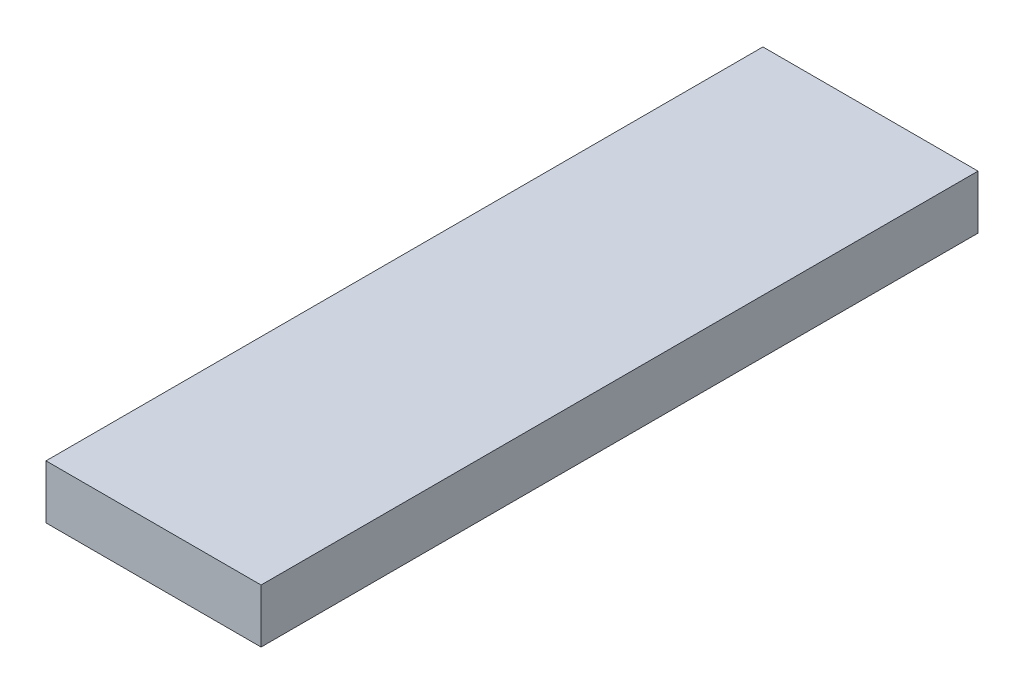
ISO-10303-21;
HEADER;
FILE_DESCRIPTION(('STEP AP214'),'2;1');
FILE_NAME('part.step','',(''),(''),'','','');
FILE_SCHEMA(('AUTOMOTIVE_DESIGN { 1 0 10303 214 1 1 1 1 }'));
ENDSEC;
DATA;
#1=APPLICATION_CONTEXT('core data for automotive mechanical design processes');
#2=APPLICATION_PROTOCOL_DEFINITION('international standard','automotive_design',2000,#1);
#3=PRODUCT_CONTEXT('',#1,'mechanical');
#4=PRODUCT('Part','Part','',(#3));
#5=PRODUCT_RELATED_PRODUCT_CATEGORY('part','',(#4));
#6=PRODUCT_DEFINITION_FORMATION('','',#4);
#7=PRODUCT_DEFINITION_CONTEXT('part definition',#1,'design');
#8=PRODUCT_DEFINITION('design','',#6,#7);
#9=PRODUCT_DEFINITION_SHAPE('','',#8);
#10=(LENGTH_UNIT() NAMED_UNIT(*) SI_UNIT(.MILLI.,.METRE.));
#11=(NAMED_UNIT(*) PLANE_ANGLE_UNIT() SI_UNIT($,.RADIAN.));
#12=(NAMED_UNIT(*) SI_UNIT($,.STERADIAN.) SOLID_ANGLE_UNIT());
#13=UNCERTAINTY_MEASURE_WITH_UNIT(LENGTH_MEASURE(1.E-05),#10,'distance_accuracy_value','');
#14=(GEOMETRIC_REPRESENTATION_CONTEXT(3) GLOBAL_UNCERTAINTY_ASSIGNED_CONTEXT((#13)) GLOBAL_UNIT_ASSIGNED_CONTEXT((#10,
#11,#12)) REPRESENTATION_CONTEXT('',''));
#15=CARTESIAN_POINT('',(0.,0.,0.));
#16=DIRECTION('',(0.,0.,1.));
#17=DIRECTION('',(1.,0.,0.));
#18=AXIS2_PLACEMENT_3D('',#15,#16,#17);
#19=CARTESIAN_POINT('',(0.,3.75,-50.));
#20=DIRECTION('',(1.,0.,0.));
#21=DIRECTION('',(0.,0.,-1.));
#22=AXIS2_PLACEMENT_3D('',#19,#20,#21);
#23=PLANE('',#22);
#24=DIRECTION('',(0.,0.,1.));
#25=VECTOR('',#24,1.);
#26=CARTESIAN_POINT('',(0.,-3.75,-50.));
#27=LINE('',#26,#25);
#28=CARTESIAN_POINT('',(0.,-3.75,-50.));
#29=VERTEX_POINT('',#28);
#30=CARTESIAN_POINT('',(0.,-3.75,50.));
#31=VERTEX_POINT('',#30);
#32=EDGE_CURVE('E149',#29,#31,#27,.T.);
#33=ORIENTED_EDGE('',*,*,#32,.T.);
#34=DIRECTION('',(0.,-1.,0.));
#35=VECTOR('',#34,1.);
#36=CARTESIAN_POINT('',(0.,3.75,50.));
#37=LINE('',#36,#35);
#38=CARTESIAN_POINT('',(0.,3.75,50.));
#39=VERTEX_POINT('',#38);
#40=EDGE_CURVE('E11',#39,#31,#37,.T.);
#41=ORIENTED_EDGE('',*,*,#40,.F.);
#42=DIRECTION('',(0.,0.,1.));
#43=VECTOR('',#42,1.);
#44=CARTESIAN_POINT('',(0.,3.75,-50.));
#45=LINE('',#44,#43);
#46=CARTESIAN_POINT('',(0.,3.75,-50.));
#47=VERTEX_POINT('',#46);
#48=EDGE_CURVE('E142',#47,#39,#45,.T.);
#49=ORIENTED_EDGE('',*,*,#48,.F.);
#50=DIRECTION('',(0.,-1.,0.));
#51=VECTOR('',#50,1.);
#52=CARTESIAN_POINT('',(0.,3.75,-50.));
#53=LINE('',#52,#51);
#54=EDGE_CURVE('E148',#47,#29,#53,.T.);
#55=ORIENTED_EDGE('',*,*,#54,.T.);
#56=EDGE_LOOP('',(#33,#41,#49,#55));
#57=FACE_BOUND('',#56,.T.);
#58=DIRECTION('',(0.,0.,1.));
#59=VECTOR('',#58,1.);
#60=CARTESIAN_POINT('',(0.,-3.25,-25.));
#61=LINE('',#60,#59);
#62=CARTESIAN_POINT('',(0.,-3.25,-25.));
#63=VERTEX_POINT('',#62);
#64=CARTESIAN_POINT('',(0.,-3.25,25.));
#65=VERTEX_POINT('',#64);
#66=EDGE_CURVE('E124',#63,#65,#61,.T.);
#67=ORIENTED_EDGE('',*,*,#66,.F.);
#68=DIRECTION('',(0.,1.,0.));
#69=VECTOR('',#68,1.);
#70=CARTESIAN_POINT('',(0.,-3.25,-25.));
#71=LINE('',#70,#69);
#72=CARTESIAN_POINT('',(0.,0.75,-25.));
#73=VERTEX_POINT('',#72);
#74=EDGE_CURVE('E153',#63,#73,#71,.T.);
#75=ORIENTED_EDGE('',*,*,#74,.T.);
#76=DIRECTION('',(0.,0.,1.));
#77=VECTOR('',#76,1.);
#78=CARTESIAN_POINT('',(0.,0.75,-25.));
#79=LINE('',#78,#77);
#80=CARTESIAN_POINT('',(0.,0.75,25.));
#81=VERTEX_POINT('',#80);
#82=EDGE_CURVE('E135',#73,#81,#79,.T.);
#83=ORIENTED_EDGE('',*,*,#82,.T.);
#84=DIRECTION('',(0.,1.,0.));
#85=VECTOR('',#84,1.);
#86=CARTESIAN_POINT('',(0.,-3.25,25.));
#87=LINE('',#86,#85);
#88=EDGE_CURVE('E117',#65,#81,#87,.T.);
#89=ORIENTED_EDGE('',*,*,#88,.F.);
#90=EDGE_LOOP('',(#67,#75,#83,#89));
#91=FACE_BOUND('',#90,.T.);
#92=ADVANCED_FACE('F40',(#57,#91),#23,.F.);
#93=CARTESIAN_POINT('',(0.,3.75,50.));
#94=DIRECTION('',(0.,0.,-1.));
#95=DIRECTION('',(-1.,0.,0.));
#96=AXIS2_PLACEMENT_3D('',#93,#94,#95);
#97=PLANE('',#96);
#98=DIRECTION('',(1.,0.,0.));
#99=VECTOR('',#98,1.);
#100=CARTESIAN_POINT('',(0.,-3.75,50.));
#101=LINE('',#100,#99);
#102=CARTESIAN_POINT('',(30.,-3.75,50.));
#103=VERTEX_POINT('',#102);
#104=EDGE_CURVE('E152',#31,#103,#101,.T.);
#105=ORIENTED_EDGE('',*,*,#104,.T.);
#106=DIRECTION('',(0.,-1.,0.));
#107=VECTOR('',#106,1.);
#108=CARTESIAN_POINT('',(30.,3.75,50.));
#109=LINE('',#108,#107);
#110=CARTESIAN_POINT('',(30.,3.75,50.));
#111=VERTEX_POINT('',#110);
#112=EDGE_CURVE('E47',#111,#103,#109,.T.);
#113=ORIENTED_EDGE('',*,*,#112,.F.);
#114=DIRECTION('',(1.,0.,0.));
#115=VECTOR('',#114,1.);
#116=CARTESIAN_POINT('',(0.,3.75,50.));
#117=LINE('',#116,#115);
#118=EDGE_CURVE('E91',#39,#111,#117,.T.);
#119=ORIENTED_EDGE('',*,*,#118,.F.);
#120=ORIENTED_EDGE('',*,*,#40,.T.);
#121=EDGE_LOOP('',(#105,#113,#119,#120));
#122=FACE_BOUND('',#121,.T.);
#123=ADVANCED_FACE('F181',(#122),#97,.F.);
#124=CARTESIAN_POINT('',(30.,3.75,-50.));
#125=DIRECTION('',(-1.,0.,0.));
#126=DIRECTION('',(0.,0.,1.));
#127=AXIS2_PLACEMENT_3D('',#124,#125,#126);
#128=PLANE('',#127);
#129=DIRECTION('',(0.,0.,-1.));
#130=VECTOR('',#129,1.);
#131=CARTESIAN_POINT('',(30.,-3.75,-50.));
#132=LINE('',#131,#130);
#133=CARTESIAN_POINT('',(30.,-3.75,-50.));
#134=VERTEX_POINT('',#133);
#135=EDGE_CURVE('E155',#103,#134,#132,.T.);
#136=ORIENTED_EDGE('',*,*,#135,.T.);
#137=DIRECTION('',(0.,-1.,0.));
#138=VECTOR('',#137,1.);
#139=CARTESIAN_POINT('',(30.,3.75,-50.));
#140=LINE('',#139,#138);
#141=CARTESIAN_POINT('',(30.,3.75,-50.));
#142=VERTEX_POINT('',#141);
#143=EDGE_CURVE('E159',#142,#134,#140,.T.);
#144=ORIENTED_EDGE('',*,*,#143,.F.);
#145=DIRECTION('',(0.,0.,-1.));
#146=VECTOR('',#145,1.);
#147=CARTESIAN_POINT('',(30.,3.75,-50.));
#148=LINE('',#147,#146);
#149=EDGE_CURVE('E145',#111,#142,#148,.T.);
#150=ORIENTED_EDGE('',*,*,#149,.F.);
#151=ORIENTED_EDGE('',*,*,#112,.T.);
#152=EDGE_LOOP('',(#136,#144,#150,#151));
#153=FACE_BOUND('',#152,.T.);
#154=ADVANCED_FACE('F164',(#153),#128,.F.);
#155=CARTESIAN_POINT('',(0.,3.75,-50.));
#156=DIRECTION('',(0.,0.,1.));
#157=DIRECTION('',(1.,0.,0.));
#158=AXIS2_PLACEMENT_3D('',#155,#156,#157);
#159=PLANE('',#158);
#160=DIRECTION('',(-1.,0.,0.));
#161=VECTOR('',#160,1.);
#162=CARTESIAN_POINT('',(0.,-3.75,-50.));
#163=LINE('',#162,#161);
#164=EDGE_CURVE('E84',#134,#29,#163,.T.);
#165=ORIENTED_EDGE('',*,*,#164,.T.);
#166=ORIENTED_EDGE('',*,*,#54,.F.);
#167=DIRECTION('',(-1.,0.,0.));
#168=VECTOR('',#167,1.);
#169=CARTESIAN_POINT('',(0.,3.75,-50.));
#170=LINE('',#169,#168);
#171=EDGE_CURVE('E63',#142,#47,#170,.T.);
#172=ORIENTED_EDGE('',*,*,#171,.F.);
#173=ORIENTED_EDGE('',*,*,#143,.T.);
#174=EDGE_LOOP('',(#165,#166,#172,#173));
#175=FACE_BOUND('',#174,.T.);
#176=ADVANCED_FACE('F172',(#175),#159,.F.);
#177=CARTESIAN_POINT('',(0.,3.75,0.));
#178=DIRECTION('',(0.,1.,0.));
#179=DIRECTION('',(0.,0.,1.));
#180=AXIS2_PLACEMENT_3D('',#177,#178,#179);
#181=PLANE('',#180);
#182=ORIENTED_EDGE('',*,*,#48,.T.);
#183=ORIENTED_EDGE('',*,*,#118,.T.);
#184=ORIENTED_EDGE('',*,*,#149,.T.);
#185=ORIENTED_EDGE('',*,*,#171,.T.);
#186=EDGE_LOOP('',(#182,#183,#184,#185));
#187=FACE_BOUND('',#186,.T.);
#188=ADVANCED_FACE('F174',(#187),#181,.T.);
#189=CARTESIAN_POINT('',(0.,-3.75,0.));
#190=DIRECTION('',(0.,1.,0.));
#191=DIRECTION('',(0.,0.,1.));
#192=AXIS2_PLACEMENT_3D('',#189,#190,#191);
#193=PLANE('',#192);
#194=ORIENTED_EDGE('',*,*,#32,.F.);
#195=ORIENTED_EDGE('',*,*,#164,.F.);
#196=ORIENTED_EDGE('',*,*,#135,.F.);
#197=ORIENTED_EDGE('',*,*,#104,.F.);
#198=EDGE_LOOP('',(#194,#195,#196,#197));
#199=FACE_BOUND('',#198,.T.);
#200=ADVANCED_FACE('F168',(#199),#193,.F.);
#201=CARTESIAN_POINT('',(0.,-3.25,-25.));
#202=DIRECTION('',(0.,0.,-1.));
#203=DIRECTION('',(-1.,0.,0.));
#204=AXIS2_PLACEMENT_3D('',#201,#202,#203);
#205=PLANE('',#204);
#206=DIRECTION('',(-1.,0.,0.));
#207=VECTOR('',#206,1.);
#208=CARTESIAN_POINT('',(0.,0.75,-25.));
#209=LINE('',#208,#207);
#210=CARTESIAN_POINT('',(15.,0.75,-25.));
#211=VERTEX_POINT('',#210);
#212=EDGE_CURVE('E133',#211,#73,#209,.T.);
#213=ORIENTED_EDGE('',*,*,#212,.T.);
#214=ORIENTED_EDGE('',*,*,#74,.F.);
#215=DIRECTION('',(-1.,0.,0.));
#216=VECTOR('',#215,1.);
#217=CARTESIAN_POINT('',(0.,-3.25,-25.));
#218=LINE('',#217,#216);
#219=CARTESIAN_POINT('',(15.,-3.25,-25.));
#220=VERTEX_POINT('',#219);
#221=EDGE_CURVE('E130',#220,#63,#218,.T.);
#222=ORIENTED_EDGE('',*,*,#221,.F.);
#223=DIRECTION('',(0.,1.,0.));
#224=VECTOR('',#223,1.);
#225=CARTESIAN_POINT('',(15.,-3.25,-25.));
#226=LINE('',#225,#224);
#227=EDGE_CURVE('E137',#220,#211,#226,.T.);
#228=ORIENTED_EDGE('',*,*,#227,.T.);
#229=EDGE_LOOP('',(#213,#214,#222,#228));
#230=FACE_BOUND('',#229,.T.);
#231=ADVANCED_FACE('F213',(#230),#205,.F.);
#232=CARTESIAN_POINT('',(15.,-3.25,-25.));
#233=DIRECTION('',(1.,0.,0.));
#234=DIRECTION('',(0.,0.,-1.));
#235=AXIS2_PLACEMENT_3D('',#232,#233,#234);
#236=PLANE('',#235);
#237=DIRECTION('',(0.,0.,-1.));
#238=VECTOR('',#237,1.);
#239=CARTESIAN_POINT('',(15.,0.75,-25.));
#240=LINE('',#239,#238);
#241=CARTESIAN_POINT('',(15.,0.75,25.));
#242=VERTEX_POINT('',#241);
#243=EDGE_CURVE('E268',#242,#211,#240,.T.);
#244=ORIENTED_EDGE('',*,*,#243,.T.);
#245=ORIENTED_EDGE('',*,*,#227,.F.);
#246=DIRECTION('',(0.,0.,-1.));
#247=VECTOR('',#246,1.);
#248=CARTESIAN_POINT('',(15.,-3.25,-25.));
#249=LINE('',#248,#247);
#250=CARTESIAN_POINT('',(15.,-3.25,25.));
#251=VERTEX_POINT('',#250);
#252=EDGE_CURVE('E123',#251,#220,#249,.T.);
#253=ORIENTED_EDGE('',*,*,#252,.F.);
#254=DIRECTION('',(0.,1.,0.));
#255=VECTOR('',#254,1.);
#256=CARTESIAN_POINT('',(15.,-3.25,25.));
#257=LINE('',#256,#255);
#258=EDGE_CURVE('E119',#251,#242,#257,.T.);
#259=ORIENTED_EDGE('',*,*,#258,.T.);
#260=EDGE_LOOP('',(#244,#245,#253,#259));
#261=FACE_BOUND('',#260,.T.);
#262=ADVANCED_FACE('F225',(#261),#236,.F.);
#263=CARTESIAN_POINT('',(0.,-3.25,25.));
#264=DIRECTION('',(0.,0.,1.));
#265=DIRECTION('',(1.,0.,0.));
#266=AXIS2_PLACEMENT_3D('',#263,#264,#265);
#267=PLANE('',#266);
#268=DIRECTION('',(1.,0.,0.));
#269=VECTOR('',#268,1.);
#270=CARTESIAN_POINT('',(0.,0.75,25.));
#271=LINE('',#270,#269);
#272=EDGE_CURVE('E54',#81,#242,#271,.T.);
#273=ORIENTED_EDGE('',*,*,#272,.T.);
#274=ORIENTED_EDGE('',*,*,#258,.F.);
#275=DIRECTION('',(1.,0.,0.));
#276=VECTOR('',#275,1.);
#277=CARTESIAN_POINT('',(0.,-3.25,25.));
#278=LINE('',#277,#276);
#279=EDGE_CURVE('E113',#65,#251,#278,.T.);
#280=ORIENTED_EDGE('',*,*,#279,.F.);
#281=ORIENTED_EDGE('',*,*,#88,.T.);
#282=EDGE_LOOP('',(#273,#274,#280,#281));
#283=FACE_BOUND('',#282,.T.);
#284=ADVANCED_FACE('F115',(#283),#267,.F.);
#285=CARTESIAN_POINT('',(0.,-3.25,0.));
#286=DIRECTION('',(0.,1.,0.));
#287=DIRECTION('',(0.,0.,1.));
#288=AXIS2_PLACEMENT_3D('',#285,#286,#287);
#289=PLANE('',#288);
#290=ORIENTED_EDGE('',*,*,#66,.T.);
#291=ORIENTED_EDGE('',*,*,#279,.T.);
#292=ORIENTED_EDGE('',*,*,#252,.T.);
#293=ORIENTED_EDGE('',*,*,#221,.T.);
#294=EDGE_LOOP('',(#290,#291,#292,#293));
#295=FACE_BOUND('',#294,.T.);
#296=ADVANCED_FACE('F128',(#295),#289,.T.);
#297=CARTESIAN_POINT('',(0.,0.75,0.));
#298=DIRECTION('',(0.,1.,0.));
#299=DIRECTION('',(0.,0.,1.));
#300=AXIS2_PLACEMENT_3D('',#297,#298,#299);
#301=PLANE('',#300);
#302=ORIENTED_EDGE('',*,*,#82,.F.);
#303=ORIENTED_EDGE('',*,*,#212,.F.);
#304=ORIENTED_EDGE('',*,*,#243,.F.);
#305=ORIENTED_EDGE('',*,*,#272,.F.);
#306=EDGE_LOOP('',(#302,#303,#304,#305));
#307=FACE_BOUND('',#306,.T.);
#308=ADVANCED_FACE('F245',(#307),#301,.F.);
#309=CLOSED_SHELL('',(#92,#123,#154,#176,#188,#200,#231,#262,#284,#296,#308));
#310=MANIFOLD_SOLID_BREP('B2',#309);
#311=ADVANCED_BREP_SHAPE_REPRESENTATION('',(#18,#310),#14);
#312=SHAPE_DEFINITION_REPRESENTATION(#9,#311);
ENDSEC;
END-ISO-10303-21;
